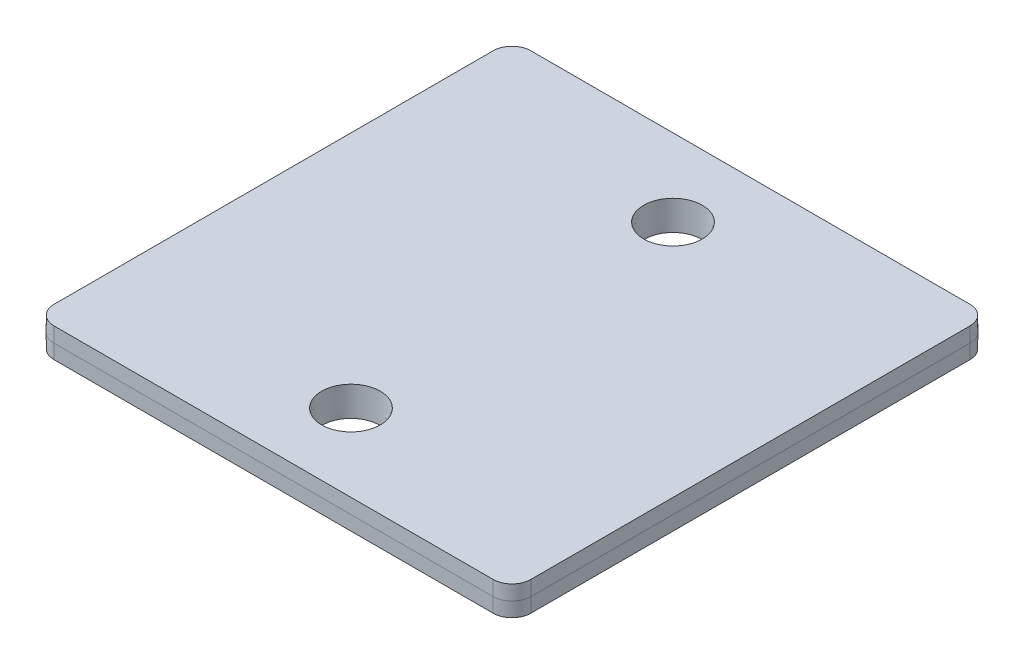
ISO-10303-21;
HEADER;
FILE_DESCRIPTION(('STEP AP214'),'2;1');
FILE_NAME('part.step','',(''),(''),'','','');
FILE_SCHEMA(('AUTOMOTIVE_DESIGN { 1 0 10303 214 1 1 1 1 }'));
ENDSEC;
DATA;
#1=APPLICATION_CONTEXT('core data for automotive mechanical design processes');
#2=APPLICATION_PROTOCOL_DEFINITION('international standard','automotive_design',2000,#1);
#3=PRODUCT_CONTEXT('',#1,'mechanical');
#4=PRODUCT('Part','Part','',(#3));
#5=PRODUCT_RELATED_PRODUCT_CATEGORY('part','',(#4));
#6=PRODUCT_DEFINITION_FORMATION('','',#4);
#7=PRODUCT_DEFINITION_CONTEXT('part definition',#1,'design');
#8=PRODUCT_DEFINITION('design','',#6,#7);
#9=PRODUCT_DEFINITION_SHAPE('','',#8);
#10=(LENGTH_UNIT() NAMED_UNIT(*) SI_UNIT(.MILLI.,.METRE.));
#11=(NAMED_UNIT(*) PLANE_ANGLE_UNIT() SI_UNIT($,.RADIAN.));
#12=(NAMED_UNIT(*) SI_UNIT($,.STERADIAN.) SOLID_ANGLE_UNIT());
#13=UNCERTAINTY_MEASURE_WITH_UNIT(LENGTH_MEASURE(1.E-05),#10,'distance_accuracy_value','');
#14=(GEOMETRIC_REPRESENTATION_CONTEXT(3) GLOBAL_UNCERTAINTY_ASSIGNED_CONTEXT((#13)) GLOBAL_UNIT_ASSIGNED_CONTEXT((#10,
#11,#12)) REPRESENTATION_CONTEXT('',''));
#15=CARTESIAN_POINT('',(0.,0.,0.));
#16=DIRECTION('',(0.,0.,1.));
#17=DIRECTION('',(1.,0.,0.));
#18=AXIS2_PLACEMENT_3D('',#15,#16,#17);
#19=CARTESIAN_POINT('',(-7.5,0.,-7.5));
#20=DIRECTION('',(0.,1.,0.));
#21=DIRECTION('',(0.,0.,1.));
#22=AXIS2_PLACEMENT_3D('',#19,#20,#21);
#23=CONICAL_SURFACE('',#22,0.649946685184632,0.0174532925199433);
#24=CARTESIAN_POINT('',(-7.5,0.,-7.5));
#25=DIRECTION('',(0.,1.,0.));
#26=DIRECTION('',(0.,0.,1.));
#27=AXIS2_PLACEMENT_3D('',#24,#25,#26);
#28=CIRCLE('',#27,0.649946685184632);
#29=CARTESIAN_POINT('',(-7.5,0.,-8.14994668518463));
#30=VERTEX_POINT('',#29);
#31=CARTESIAN_POINT('',(-8.14994668518463,0.,-7.5));
#32=VERTEX_POINT('',#31);
#33=EDGE_CURVE('E143',#30,#32,#28,.T.);
#34=ORIENTED_EDGE('',*,*,#33,.F.);
#35=DIRECTION('',(0.,0.999847695156391,-0.0174524064372835));
#36=VECTOR('',#35,1.);
#37=CARTESIAN_POINT('',(-7.5,0.,-8.14994668518463));
#38=LINE('',#37,#36);
#39=CARTESIAN_POINT('',(-7.5,-0.5,-8.14121915272052));
#40=VERTEX_POINT('',#39);
#41=EDGE_CURVE('E11',#40,#30,#38,.T.);
#42=ORIENTED_EDGE('',*,*,#41,.F.);
#43=CARTESIAN_POINT('',(-7.5,-0.5,-7.5));
#44=DIRECTION('',(0.,1.,0.));
#45=DIRECTION('',(0.,0.,1.));
#46=AXIS2_PLACEMENT_3D('',#43,#44,#45);
#47=CIRCLE('',#46,0.641219152720523);
#48=CARTESIAN_POINT('',(-8.14121915272052,-0.5,-7.5));
#49=VERTEX_POINT('',#48);
#50=EDGE_CURVE('E168',#40,#49,#47,.T.);
#51=ORIENTED_EDGE('',*,*,#50,.T.);
#52=DIRECTION('',(-0.0174524064372836,0.999847695156391,0.));
#53=VECTOR('',#52,1.);
#54=CARTESIAN_POINT('',(-8.14994668518463,0.,-7.5));
#55=LINE('',#54,#53);
#56=EDGE_CURVE('E90',#49,#32,#55,.T.);
#57=ORIENTED_EDGE('',*,*,#56,.T.);
#58=EDGE_LOOP('',(#34,#42,#51,#57));
#59=FACE_BOUND('',#58,.T.);
#60=ADVANCED_FACE('F40',(#59),#23,.T.);
#61=CARTESIAN_POINT('',(7.5,0.,-8.14994668518463));
#62=DIRECTION('',(0.,-0.0174524064372835,-0.999847695156391));
#63=DIRECTION('',(0.,0.999847695156391,-0.0174524064372836));
#64=AXIS2_PLACEMENT_3D('',#61,#62,#63);
#65=PLANE('',#64);
#66=DIRECTION('',(-1.,0.,0.));
#67=VECTOR('',#66,1.);
#68=CARTESIAN_POINT('',(7.5,0.,-8.14994668518463));
#69=LINE('',#68,#67);
#70=CARTESIAN_POINT('',(7.5,0.,-8.14994668518463));
#71=VERTEX_POINT('',#70);
#72=EDGE_CURVE('E154',#71,#30,#69,.T.);
#73=ORIENTED_EDGE('',*,*,#72,.F.);
#74=DIRECTION('',(0.,0.999847695156391,-0.0174524064372836));
#75=VECTOR('',#74,1.);
#76=CARTESIAN_POINT('',(7.5,0.,-8.14994668518463));
#77=LINE('',#76,#75);
#78=CARTESIAN_POINT('',(7.5,-0.5,-8.14121915272052));
#79=VERTEX_POINT('',#78);
#80=EDGE_CURVE('E51',#79,#71,#77,.T.);
#81=ORIENTED_EDGE('',*,*,#80,.F.);
#82=DIRECTION('',(-1.,0.,0.));
#83=VECTOR('',#82,1.);
#84=CARTESIAN_POINT('',(-7.5,-0.5,-8.14121915272052));
#85=LINE('',#84,#83);
#86=EDGE_CURVE('E157',#79,#40,#85,.T.);
#87=ORIENTED_EDGE('',*,*,#86,.T.);
#88=ORIENTED_EDGE('',*,*,#41,.T.);
#89=EDGE_LOOP('',(#73,#81,#87,#88));
#90=FACE_BOUND('',#89,.T.);
#91=ADVANCED_FACE('F42',(#90),#65,.T.);
#92=CARTESIAN_POINT('',(7.5,0.,-7.5));
#93=DIRECTION('',(0.,1.,0.));
#94=DIRECTION('',(0.,0.,1.));
#95=AXIS2_PLACEMENT_3D('',#92,#93,#94);
#96=CONICAL_SURFACE('',#95,0.649946685184632,0.0174532925199433);
#97=CARTESIAN_POINT('',(7.5,0.,-7.5));
#98=DIRECTION('',(0.,1.,0.));
#99=DIRECTION('',(0.,0.,1.));
#100=AXIS2_PLACEMENT_3D('',#97,#98,#99);
#101=CIRCLE('',#100,0.649946685184632);
#102=CARTESIAN_POINT('',(8.14994668518463,0.,-7.5));
#103=VERTEX_POINT('',#102);
#104=EDGE_CURVE('E169',#103,#71,#101,.T.);
#105=ORIENTED_EDGE('',*,*,#104,.F.);
#106=DIRECTION('',(0.0174524064372835,0.999847695156391,0.));
#107=VECTOR('',#106,1.);
#108=CARTESIAN_POINT('',(8.14994668518463,0.,-7.5));
#109=LINE('',#108,#107);
#110=CARTESIAN_POINT('',(8.14121915272053,-0.5,-7.5));
#111=VERTEX_POINT('',#110);
#112=EDGE_CURVE('E103',#111,#103,#109,.T.);
#113=ORIENTED_EDGE('',*,*,#112,.F.);
#114=CARTESIAN_POINT('',(7.5,-0.5,-7.5));
#115=DIRECTION('',(0.,1.,0.));
#116=DIRECTION('',(0.,0.,1.));
#117=AXIS2_PLACEMENT_3D('',#114,#115,#116);
#118=CIRCLE('',#117,0.641219152720523);
#119=EDGE_CURVE('E267',#111,#79,#118,.T.);
#120=ORIENTED_EDGE('',*,*,#119,.T.);
#121=ORIENTED_EDGE('',*,*,#80,.T.);
#122=EDGE_LOOP('',(#105,#113,#120,#121));
#123=FACE_BOUND('',#122,.T.);
#124=ADVANCED_FACE('F312',(#123),#96,.T.);
#125=CARTESIAN_POINT('',(8.14994668518463,0.,7.5));
#126=DIRECTION('',(0.999847695156391,-0.0174524064372835,0.));
#127=DIRECTION('',(0.0174524064372835,0.999847695156391,0.));
#128=AXIS2_PLACEMENT_3D('',#125,#126,#127);
#129=PLANE('',#128);
#130=DIRECTION('',(0.,0.,-1.));
#131=VECTOR('',#130,1.);
#132=CARTESIAN_POINT('',(8.14994668518463,0.,7.5));
#133=LINE('',#132,#131);
#134=CARTESIAN_POINT('',(8.14994668518463,0.,7.5));
#135=VERTEX_POINT('',#134);
#136=EDGE_CURVE('E240',#135,#103,#133,.T.);
#137=ORIENTED_EDGE('',*,*,#136,.F.);
#138=DIRECTION('',(0.0174524064372836,0.999847695156391,0.));
#139=VECTOR('',#138,1.);
#140=CARTESIAN_POINT('',(8.14994668518463,0.,7.5));
#141=LINE('',#140,#139);
#142=CARTESIAN_POINT('',(8.14121915272053,-0.5,7.5));
#143=VERTEX_POINT('',#142);
#144=EDGE_CURVE('E256',#143,#135,#141,.T.);
#145=ORIENTED_EDGE('',*,*,#144,.F.);
#146=DIRECTION('',(0.,0.,-1.));
#147=VECTOR('',#146,1.);
#148=CARTESIAN_POINT('',(8.14121915272053,-0.5,-7.5));
#149=LINE('',#148,#147);
#150=EDGE_CURVE('E270',#143,#111,#149,.T.);
#151=ORIENTED_EDGE('',*,*,#150,.T.);
#152=ORIENTED_EDGE('',*,*,#112,.T.);
#153=EDGE_LOOP('',(#137,#145,#151,#152));
#154=FACE_BOUND('',#153,.T.);
#155=ADVANCED_FACE('F317',(#154),#129,.T.);
#156=CARTESIAN_POINT('',(7.5,0.,7.5));
#157=DIRECTION('',(0.,1.,0.));
#158=DIRECTION('',(0.,0.,1.));
#159=AXIS2_PLACEMENT_3D('',#156,#157,#158);
#160=CONICAL_SURFACE('',#159,0.649946685184632,0.0174532925199433);
#161=CARTESIAN_POINT('',(7.5,0.,7.5));
#162=DIRECTION('',(0.,1.,0.));
#163=DIRECTION('',(0.,0.,1.));
#164=AXIS2_PLACEMENT_3D('',#161,#162,#163);
#165=CIRCLE('',#164,0.649946685184632);
#166=CARTESIAN_POINT('',(7.5,0.,8.14994668518463));
#167=VERTEX_POINT('',#166);
#168=EDGE_CURVE('E236',#167,#135,#165,.T.);
#169=ORIENTED_EDGE('',*,*,#168,.F.);
#170=DIRECTION('',(0.,0.999847695156391,0.0174524064372835));
#171=VECTOR('',#170,1.);
#172=CARTESIAN_POINT('',(7.5,0.,8.14994668518463));
#173=LINE('',#172,#171);
#174=CARTESIAN_POINT('',(7.5,-0.5,8.14121915272052));
#175=VERTEX_POINT('',#174);
#176=EDGE_CURVE('E253',#175,#167,#173,.T.);
#177=ORIENTED_EDGE('',*,*,#176,.F.);
#178=CARTESIAN_POINT('',(7.5,-0.5,7.5));
#179=DIRECTION('',(0.,1.,0.));
#180=DIRECTION('',(0.,0.,1.));
#181=AXIS2_PLACEMENT_3D('',#178,#179,#180);
#182=CIRCLE('',#181,0.641219152720523);
#183=EDGE_CURVE('E273',#175,#143,#182,.T.);
#184=ORIENTED_EDGE('',*,*,#183,.T.);
#185=ORIENTED_EDGE('',*,*,#144,.T.);
#186=EDGE_LOOP('',(#169,#177,#184,#185));
#187=FACE_BOUND('',#186,.T.);
#188=ADVANCED_FACE('F322',(#187),#160,.T.);
#189=CARTESIAN_POINT('',(-7.5,0.,8.14994668518463));
#190=DIRECTION('',(0.,-0.0174524064372835,0.999847695156391));
#191=DIRECTION('',(0.,-0.999847695156391,-0.0174524064372836));
#192=AXIS2_PLACEMENT_3D('',#189,#190,#191);
#193=PLANE('',#192);
#194=DIRECTION('',(1.,0.,0.));
#195=VECTOR('',#194,1.);
#196=CARTESIAN_POINT('',(-7.5,0.,8.14994668518463));
#197=LINE('',#196,#195);
#198=CARTESIAN_POINT('',(-7.5,0.,8.14994668518463));
#199=VERTEX_POINT('',#198);
#200=EDGE_CURVE('E232',#199,#167,#197,.T.);
#201=ORIENTED_EDGE('',*,*,#200,.F.);
#202=DIRECTION('',(0.,0.999847695156391,0.0174524064372836));
#203=VECTOR('',#202,1.);
#204=CARTESIAN_POINT('',(-7.5,0.,8.14994668518463));
#205=LINE('',#204,#203);
#206=CARTESIAN_POINT('',(-7.5,-0.5,8.14121915272052));
#207=VERTEX_POINT('',#206);
#208=EDGE_CURVE('E250',#207,#199,#205,.T.);
#209=ORIENTED_EDGE('',*,*,#208,.F.);
#210=DIRECTION('',(1.,0.,0.));
#211=VECTOR('',#210,1.);
#212=CARTESIAN_POINT('',(-7.5,-0.5,8.14121915272053));
#213=LINE('',#212,#211);
#214=EDGE_CURVE('E277',#207,#175,#213,.T.);
#215=ORIENTED_EDGE('',*,*,#214,.T.);
#216=ORIENTED_EDGE('',*,*,#176,.T.);
#217=EDGE_LOOP('',(#201,#209,#215,#216));
#218=FACE_BOUND('',#217,.T.);
#219=ADVANCED_FACE('F291',(#218),#193,.T.);
#220=CARTESIAN_POINT('',(-7.5,0.,7.5));
#221=DIRECTION('',(0.,1.,0.));
#222=DIRECTION('',(0.,0.,1.));
#223=AXIS2_PLACEMENT_3D('',#220,#221,#222);
#224=CONICAL_SURFACE('',#223,0.649946685184632,0.0174532925199433);
#225=CARTESIAN_POINT('',(-7.5,0.,7.5));
#226=DIRECTION('',(0.,1.,0.));
#227=DIRECTION('',(0.,0.,1.));
#228=AXIS2_PLACEMENT_3D('',#225,#226,#227);
#229=CIRCLE('',#228,0.649946685184632);
#230=CARTESIAN_POINT('',(-8.14994668518463,0.,7.5));
#231=VERTEX_POINT('',#230);
#232=EDGE_CURVE('E228',#231,#199,#229,.T.);
#233=ORIENTED_EDGE('',*,*,#232,.F.);
#234=DIRECTION('',(-0.0174524064372835,0.999847695156391,0.));
#235=VECTOR('',#234,1.);
#236=CARTESIAN_POINT('',(-8.14994668518463,0.,7.5));
#237=LINE('',#236,#235);
#238=CARTESIAN_POINT('',(-8.14121915272052,-0.5,7.5));
#239=VERTEX_POINT('',#238);
#240=EDGE_CURVE('E83',#239,#231,#237,.T.);
#241=ORIENTED_EDGE('',*,*,#240,.F.);
#242=CARTESIAN_POINT('',(-7.5,-0.5,7.5));
#243=DIRECTION('',(0.,1.,0.));
#244=DIRECTION('',(0.,0.,1.));
#245=AXIS2_PLACEMENT_3D('',#242,#243,#244);
#246=CIRCLE('',#245,0.641219152720523);
#247=EDGE_CURVE('E280',#239,#207,#246,.T.);
#248=ORIENTED_EDGE('',*,*,#247,.T.);
#249=ORIENTED_EDGE('',*,*,#208,.T.);
#250=EDGE_LOOP('',(#233,#241,#248,#249));
#251=FACE_BOUND('',#250,.T.);
#252=ADVANCED_FACE('F293',(#251),#224,.T.);
#253=CARTESIAN_POINT('',(-8.14994668518463,0.,-7.5));
#254=DIRECTION('',(-0.999847695156391,-0.0174524064372835,0.));
#255=DIRECTION('',(0.0174524064372835,-0.999847695156391,0.));
#256=AXIS2_PLACEMENT_3D('',#253,#254,#255);
#257=PLANE('',#256);
#258=DIRECTION('',(0.,0.,1.));
#259=VECTOR('',#258,1.);
#260=CARTESIAN_POINT('',(-8.14994668518463,0.,-7.5));
#261=LINE('',#260,#259);
#262=EDGE_CURVE('E148',#32,#231,#261,.T.);
#263=ORIENTED_EDGE('',*,*,#262,.F.);
#264=ORIENTED_EDGE('',*,*,#56,.F.);
#265=DIRECTION('',(0.,0.,1.));
#266=VECTOR('',#265,1.);
#267=CARTESIAN_POINT('',(-8.14121915272052,-0.5,-7.5));
#268=LINE('',#267,#266);
#269=EDGE_CURVE('E44',#49,#239,#268,.T.);
#270=ORIENTED_EDGE('',*,*,#269,.T.);
#271=ORIENTED_EDGE('',*,*,#240,.T.);
#272=EDGE_LOOP('',(#263,#264,#270,#271));
#273=FACE_BOUND('',#272,.T.);
#274=ADVANCED_FACE('F283',(#273),#257,.T.);
#275=CARTESIAN_POINT('',(-7.5,-0.5,-7.5));
#276=DIRECTION('',(0.,1.,0.));
#277=DIRECTION('',(0.,0.,1.));
#278=AXIS2_PLACEMENT_3D('',#275,#276,#277);
#279=PLANE('',#278);
#280=CARTESIAN_POINT('',(0.,-0.5,-5.5));
#281=DIRECTION('',(0.,1.,0.));
#282=DIRECTION('',(0.,0.,1.));
#283=AXIS2_PLACEMENT_3D('',#280,#281,#282);
#284=CIRCLE('',#283,0.982544935071782);
#285=CARTESIAN_POINT('',(0.,-0.5,-4.51745506492822));
#286=VERTEX_POINT('',#285);
#287=EDGE_CURVE('E208',#286,#286,#284,.T.);
#288=ORIENTED_EDGE('',*,*,#287,.T.);
#289=EDGE_LOOP('',(#288));
#290=FACE_BOUND('',#289,.T.);
#291=CARTESIAN_POINT('',(0.,-0.5,5.5));
#292=DIRECTION('',(0.,1.,0.));
#293=DIRECTION('',(0.,0.,1.));
#294=AXIS2_PLACEMENT_3D('',#291,#292,#293);
#295=CIRCLE('',#294,0.982544935071782);
#296=CARTESIAN_POINT('',(0.,-0.5,6.48254493507178));
#297=VERTEX_POINT('',#296);
#298=EDGE_CURVE('E456',#297,#297,#295,.T.);
#299=ORIENTED_EDGE('',*,*,#298,.T.);
#300=EDGE_LOOP('',(#299));
#301=FACE_BOUND('',#300,.T.);
#302=ORIENTED_EDGE('',*,*,#50,.F.);
#303=ORIENTED_EDGE('',*,*,#86,.F.);
#304=ORIENTED_EDGE('',*,*,#119,.F.);
#305=ORIENTED_EDGE('',*,*,#150,.F.);
#306=ORIENTED_EDGE('',*,*,#183,.F.);
#307=ORIENTED_EDGE('',*,*,#214,.F.);
#308=ORIENTED_EDGE('',*,*,#247,.F.);
#309=ORIENTED_EDGE('',*,*,#269,.F.);
#310=EDGE_LOOP('',(#302,#303,#304,#305,#306,#307,#308,#309));
#311=FACE_BOUND('',#310,.T.);
#312=ADVANCED_FACE('F285',(#290,#301,#311),#279,.F.);
#313=CARTESIAN_POINT('',(-7.5,0.,-7.5));
#314=DIRECTION('',(0.,-1.,0.));
#315=DIRECTION('',(0.,0.,1.));
#316=AXIS2_PLACEMENT_3D('',#313,#314,#315);
#317=CONICAL_SURFACE('',#316,0.649946685184632,0.0174532925199433);
#318=ORIENTED_EDGE('',*,*,#33,.T.);
#319=DIRECTION('',(-0.0174524064372835,-0.999847695156391,0.));
#320=VECTOR('',#319,1.);
#321=CARTESIAN_POINT('',(-8.14994668518463,0.,-7.5));
#322=LINE('',#321,#320);
#323=CARTESIAN_POINT('',(-8.14121915272052,0.5,-7.5));
#324=VERTEX_POINT('',#323);
#325=EDGE_CURVE('E149',#324,#32,#322,.T.);
#326=ORIENTED_EDGE('',*,*,#325,.F.);
#327=CARTESIAN_POINT('',(-7.5,0.5,-7.5));
#328=DIRECTION('',(0.,1.,0.));
#329=DIRECTION('',(0.,0.,1.));
#330=AXIS2_PLACEMENT_3D('',#327,#328,#329);
#331=CIRCLE('',#330,0.641219152720523);
#332=CARTESIAN_POINT('',(-7.5,0.5,-8.14121915272052));
#333=VERTEX_POINT('',#332);
#334=EDGE_CURVE('E173',#333,#324,#331,.T.);
#335=ORIENTED_EDGE('',*,*,#334,.F.);
#336=DIRECTION('',(0.,-0.999847695156391,-0.0174524064372836));
#337=VECTOR('',#336,1.);
#338=CARTESIAN_POINT('',(-7.5,0.,-8.14994668518463));
#339=LINE('',#338,#337);
#340=EDGE_CURVE('E163',#333,#30,#339,.T.);
#341=ORIENTED_EDGE('',*,*,#340,.T.);
#342=EDGE_LOOP('',(#318,#326,#335,#341));
#343=FACE_BOUND('',#342,.T.);
#344=ADVANCED_FACE('F171',(#343),#317,.T.);
#345=CARTESIAN_POINT('',(-8.14994668518463,0.,-7.5));
#346=DIRECTION('',(-0.999847695156391,0.0174524064372835,0.));
#347=DIRECTION('',(-0.0174524064372835,-0.999847695156391,0.));
#348=AXIS2_PLACEMENT_3D('',#345,#346,#347);
#349=PLANE('',#348);
#350=ORIENTED_EDGE('',*,*,#262,.T.);
#351=DIRECTION('',(-0.0174524064372836,-0.999847695156391,0.));
#352=VECTOR('',#351,1.);
#353=CARTESIAN_POINT('',(-8.14994668518463,0.,7.5));
#354=LINE('',#353,#352);
#355=CARTESIAN_POINT('',(-8.14121915272052,0.5,7.5));
#356=VERTEX_POINT('',#355);
#357=EDGE_CURVE('E201',#356,#231,#354,.T.);
#358=ORIENTED_EDGE('',*,*,#357,.F.);
#359=DIRECTION('',(0.,0.,-1.));
#360=VECTOR('',#359,1.);
#361=CARTESIAN_POINT('',(-8.14121915272052,0.5,-7.5));
#362=LINE('',#361,#360);
#363=EDGE_CURVE('E207',#324,#356,#362,.F.);
#364=ORIENTED_EDGE('',*,*,#363,.F.);
#365=ORIENTED_EDGE('',*,*,#325,.T.);
#366=EDGE_LOOP('',(#350,#358,#364,#365));
#367=FACE_BOUND('',#366,.T.);
#368=ADVANCED_FACE('F299',(#367),#349,.T.);
#369=CARTESIAN_POINT('',(-7.5,0.,7.5));
#370=DIRECTION('',(0.,-1.,0.));
#371=DIRECTION('',(0.,0.,1.));
#372=AXIS2_PLACEMENT_3D('',#369,#370,#371);
#373=CONICAL_SURFACE('',#372,0.649946685184632,0.0174532925199433);
#374=ORIENTED_EDGE('',*,*,#232,.T.);
#375=DIRECTION('',(0.,-0.999847695156391,0.0174524064372835));
#376=VECTOR('',#375,1.);
#377=CARTESIAN_POINT('',(-7.5,0.,8.14994668518463));
#378=LINE('',#377,#376);
#379=CARTESIAN_POINT('',(-7.5,0.5,8.14121915272052));
#380=VERTEX_POINT('',#379);
#381=EDGE_CURVE('E197',#380,#199,#378,.T.);
#382=ORIENTED_EDGE('',*,*,#381,.F.);
#383=CARTESIAN_POINT('',(-7.5,0.5,7.5));
#384=DIRECTION('',(0.,1.,0.));
#385=DIRECTION('',(0.,0.,1.));
#386=AXIS2_PLACEMENT_3D('',#383,#384,#385);
#387=CIRCLE('',#386,0.641219152720523);
#388=EDGE_CURVE('E211',#356,#380,#387,.T.);
#389=ORIENTED_EDGE('',*,*,#388,.F.);
#390=ORIENTED_EDGE('',*,*,#357,.T.);
#391=EDGE_LOOP('',(#374,#382,#389,#390));
#392=FACE_BOUND('',#391,.T.);
#393=ADVANCED_FACE('F301',(#392),#373,.T.);
#394=CARTESIAN_POINT('',(-7.5,0.,8.14994668518463));
#395=DIRECTION('',(0.,0.0174524064372835,0.999847695156391));
#396=DIRECTION('',(0.,-0.999847695156391,0.0174524064372836));
#397=AXIS2_PLACEMENT_3D('',#394,#395,#396);
#398=PLANE('',#397);
#399=ORIENTED_EDGE('',*,*,#200,.T.);
#400=DIRECTION('',(0.,-0.999847695156391,0.0174524064372836));
#401=VECTOR('',#400,1.);
#402=CARTESIAN_POINT('',(7.5,0.,8.14994668518463));
#403=LINE('',#402,#401);
#404=CARTESIAN_POINT('',(7.5,0.5,8.14121915272052));
#405=VERTEX_POINT('',#404);
#406=EDGE_CURVE('E193',#405,#167,#403,.T.);
#407=ORIENTED_EDGE('',*,*,#406,.F.);
#408=DIRECTION('',(-1.,0.,0.));
#409=VECTOR('',#408,1.);
#410=CARTESIAN_POINT('',(-7.5,0.5,8.14121915272052));
#411=LINE('',#410,#409);
#412=EDGE_CURVE('E214',#380,#405,#411,.F.);
#413=ORIENTED_EDGE('',*,*,#412,.F.);
#414=ORIENTED_EDGE('',*,*,#381,.T.);
#415=EDGE_LOOP('',(#399,#407,#413,#414));
#416=FACE_BOUND('',#415,.T.);
#417=ADVANCED_FACE('F324',(#416),#398,.T.);
#418=CARTESIAN_POINT('',(7.5,0.,7.5));
#419=DIRECTION('',(0.,-1.,0.));
#420=DIRECTION('',(0.,0.,1.));
#421=AXIS2_PLACEMENT_3D('',#418,#419,#420);
#422=CONICAL_SURFACE('',#421,0.649946685184632,0.0174532925199433);
#423=ORIENTED_EDGE('',*,*,#168,.T.);
#424=DIRECTION('',(0.0174524064372835,-0.999847695156391,0.));
#425=VECTOR('',#424,1.);
#426=CARTESIAN_POINT('',(8.14994668518463,0.,7.5));
#427=LINE('',#426,#425);
#428=CARTESIAN_POINT('',(8.14121915272053,0.5,7.5));
#429=VERTEX_POINT('',#428);
#430=EDGE_CURVE('E189',#429,#135,#427,.T.);
#431=ORIENTED_EDGE('',*,*,#430,.F.);
#432=CARTESIAN_POINT('',(7.5,0.5,7.5));
#433=DIRECTION('',(0.,1.,0.));
#434=DIRECTION('',(0.,0.,1.));
#435=AXIS2_PLACEMENT_3D('',#432,#433,#434);
#436=CIRCLE('',#435,0.641219152720523);
#437=EDGE_CURVE('E217',#405,#429,#436,.T.);
#438=ORIENTED_EDGE('',*,*,#437,.F.);
#439=ORIENTED_EDGE('',*,*,#406,.T.);
#440=EDGE_LOOP('',(#423,#431,#438,#439));
#441=FACE_BOUND('',#440,.T.);
#442=ADVANCED_FACE('F319',(#441),#422,.T.);
#443=CARTESIAN_POINT('',(8.14994668518463,0.,7.5));
#444=DIRECTION('',(0.999847695156391,0.0174524064372835,0.));
#445=DIRECTION('',(-0.0174524064372835,0.999847695156391,0.));
#446=AXIS2_PLACEMENT_3D('',#443,#444,#445);
#447=PLANE('',#446);
#448=ORIENTED_EDGE('',*,*,#136,.T.);
#449=DIRECTION('',(0.0174524064372836,-0.999847695156391,0.));
#450=VECTOR('',#449,1.);
#451=CARTESIAN_POINT('',(8.14994668518463,0.,-7.5));
#452=LINE('',#451,#450);
#453=CARTESIAN_POINT('',(8.14121915272053,0.5,-7.5));
#454=VERTEX_POINT('',#453);
#455=EDGE_CURVE('E179',#454,#103,#452,.T.);
#456=ORIENTED_EDGE('',*,*,#455,.F.);
#457=DIRECTION('',(0.,0.,1.));
#458=VECTOR('',#457,1.);
#459=CARTESIAN_POINT('',(8.14121915272053,0.5,7.5));
#460=LINE('',#459,#458);
#461=EDGE_CURVE('E220',#429,#454,#460,.F.);
#462=ORIENTED_EDGE('',*,*,#461,.F.);
#463=ORIENTED_EDGE('',*,*,#430,.T.);
#464=EDGE_LOOP('',(#448,#456,#462,#463));
#465=FACE_BOUND('',#464,.T.);
#466=ADVANCED_FACE('F315',(#465),#447,.T.);
#467=CARTESIAN_POINT('',(7.5,0.,-7.5));
#468=DIRECTION('',(0.,-1.,0.));
#469=DIRECTION('',(0.,0.,1.));
#470=AXIS2_PLACEMENT_3D('',#467,#468,#469);
#471=CONICAL_SURFACE('',#470,0.649946685184632,0.0174532925199433);
#472=ORIENTED_EDGE('',*,*,#104,.T.);
#473=DIRECTION('',(0.,-0.999847695156391,-0.0174524064372835));
#474=VECTOR('',#473,1.);
#475=CARTESIAN_POINT('',(7.5,0.,-8.14994668518463));
#476=LINE('',#475,#474);
#477=CARTESIAN_POINT('',(7.5,0.5,-8.14121915272052));
#478=VERTEX_POINT('',#477);
#479=EDGE_CURVE('E166',#478,#71,#476,.T.);
#480=ORIENTED_EDGE('',*,*,#479,.F.);
#481=CARTESIAN_POINT('',(7.5,0.5,-7.5));
#482=DIRECTION('',(0.,1.,0.));
#483=DIRECTION('',(0.,0.,1.));
#484=AXIS2_PLACEMENT_3D('',#481,#482,#483);
#485=CIRCLE('',#484,0.641219152720523);
#486=EDGE_CURVE('E181',#454,#478,#485,.T.);
#487=ORIENTED_EDGE('',*,*,#486,.F.);
#488=ORIENTED_EDGE('',*,*,#455,.T.);
#489=EDGE_LOOP('',(#472,#480,#487,#488));
#490=FACE_BOUND('',#489,.T.);
#491=ADVANCED_FACE('F311',(#490),#471,.T.);
#492=CARTESIAN_POINT('',(7.5,0.,-8.14994668518463));
#493=DIRECTION('',(0.,0.0174524064372835,-0.999847695156391));
#494=DIRECTION('',(0.,0.999847695156391,0.0174524064372836));
#495=AXIS2_PLACEMENT_3D('',#492,#493,#494);
#496=PLANE('',#495);
#497=ORIENTED_EDGE('',*,*,#72,.T.);
#498=ORIENTED_EDGE('',*,*,#340,.F.);
#499=DIRECTION('',(1.,0.,0.));
#500=VECTOR('',#499,1.);
#501=CARTESIAN_POINT('',(7.5,0.5,-8.14121915272052));
#502=LINE('',#501,#500);
#503=EDGE_CURVE('E175',#478,#333,#502,.F.);
#504=ORIENTED_EDGE('',*,*,#503,.F.);
#505=ORIENTED_EDGE('',*,*,#479,.T.);
#506=EDGE_LOOP('',(#497,#498,#504,#505));
#507=FACE_BOUND('',#506,.T.);
#508=ADVANCED_FACE('F161',(#507),#496,.T.);
#509=CARTESIAN_POINT('',(-7.5,0.5,-7.5));
#510=DIRECTION('',(0.,1.,0.));
#511=DIRECTION('',(0.,0.,1.));
#512=AXIS2_PLACEMENT_3D('',#509,#510,#511);
#513=PLANE('',#512);
#514=CARTESIAN_POINT('',(0.,0.5,-5.5));
#515=DIRECTION('',(0.,1.,0.));
#516=DIRECTION('',(0.,0.,1.));
#517=AXIS2_PLACEMENT_3D('',#514,#515,#516);
#518=CIRCLE('',#517,1.);
#519=CARTESIAN_POINT('',(0.,0.5,-4.5));
#520=VERTEX_POINT('',#519);
#521=EDGE_CURVE('E452',#520,#520,#518,.T.);
#522=ORIENTED_EDGE('',*,*,#521,.F.);
#523=EDGE_LOOP('',(#522));
#524=FACE_BOUND('',#523,.T.);
#525=CARTESIAN_POINT('',(0.,0.5,5.5));
#526=DIRECTION('',(0.,1.,0.));
#527=DIRECTION('',(0.,0.,1.));
#528=AXIS2_PLACEMENT_3D('',#525,#526,#527);
#529=CIRCLE('',#528,1.);
#530=CARTESIAN_POINT('',(0.,0.5,6.5));
#531=VERTEX_POINT('',#530);
#532=EDGE_CURVE('E461',#531,#531,#529,.T.);
#533=ORIENTED_EDGE('',*,*,#532,.F.);
#534=EDGE_LOOP('',(#533));
#535=FACE_BOUND('',#534,.T.);
#536=ORIENTED_EDGE('',*,*,#334,.T.);
#537=ORIENTED_EDGE('',*,*,#363,.T.);
#538=ORIENTED_EDGE('',*,*,#388,.T.);
#539=ORIENTED_EDGE('',*,*,#412,.T.);
#540=ORIENTED_EDGE('',*,*,#437,.T.);
#541=ORIENTED_EDGE('',*,*,#461,.T.);
#542=ORIENTED_EDGE('',*,*,#486,.T.);
#543=ORIENTED_EDGE('',*,*,#503,.T.);
#544=EDGE_LOOP('',(#536,#537,#538,#539,#540,#541,#542,#543));
#545=FACE_BOUND('',#544,.T.);
#546=ADVANCED_FACE('F304',(#524,#535,#545),#513,.T.);
#547=CARTESIAN_POINT('',(0.,0.5,5.5));
#548=DIRECTION('',(0.,1.,0.));
#549=DIRECTION('',(0.,0.,1.));
#550=AXIS2_PLACEMENT_3D('',#547,#548,#549);
#551=CONICAL_SURFACE('',#550,1.,0.0174532925199433);
#552=ORIENTED_EDGE('',*,*,#532,.T.);
#553=EDGE_LOOP('',(#552));
#554=FACE_BOUND('',#553,.T.);
#555=ORIENTED_EDGE('',*,*,#298,.F.);
#556=EDGE_LOOP('',(#555));
#557=FACE_BOUND('',#556,.T.);
#558=ADVANCED_FACE('F423',(#554,#557),#551,.F.);
#559=CARTESIAN_POINT('',(0.,0.5,-5.5));
#560=DIRECTION('',(0.,1.,0.));
#561=DIRECTION('',(0.,0.,1.));
#562=AXIS2_PLACEMENT_3D('',#559,#560,#561);
#563=CONICAL_SURFACE('',#562,1.,0.0174532925199433);
#564=ORIENTED_EDGE('',*,*,#521,.T.);
#565=EDGE_LOOP('',(#564));
#566=FACE_BOUND('',#565,.T.);
#567=ORIENTED_EDGE('',*,*,#287,.F.);
#568=EDGE_LOOP('',(#567));
#569=FACE_BOUND('',#568,.T.);
#570=ADVANCED_FACE('F434',(#566,#569),#563,.F.);
#571=CLOSED_SHELL('',(#60,#91,#124,#155,#188,#219,#252,#274,#312,#344,#368,#393,#417,#442,#466,
#491,#508,#546,#558,#570));
#572=MANIFOLD_SOLID_BREP('B2',#571);
#573=ADVANCED_BREP_SHAPE_REPRESENTATION('',(#18,#572),#14);
#574=SHAPE_DEFINITION_REPRESENTATION(#9,#573);
ENDSEC;
END-ISO-10303-21;
